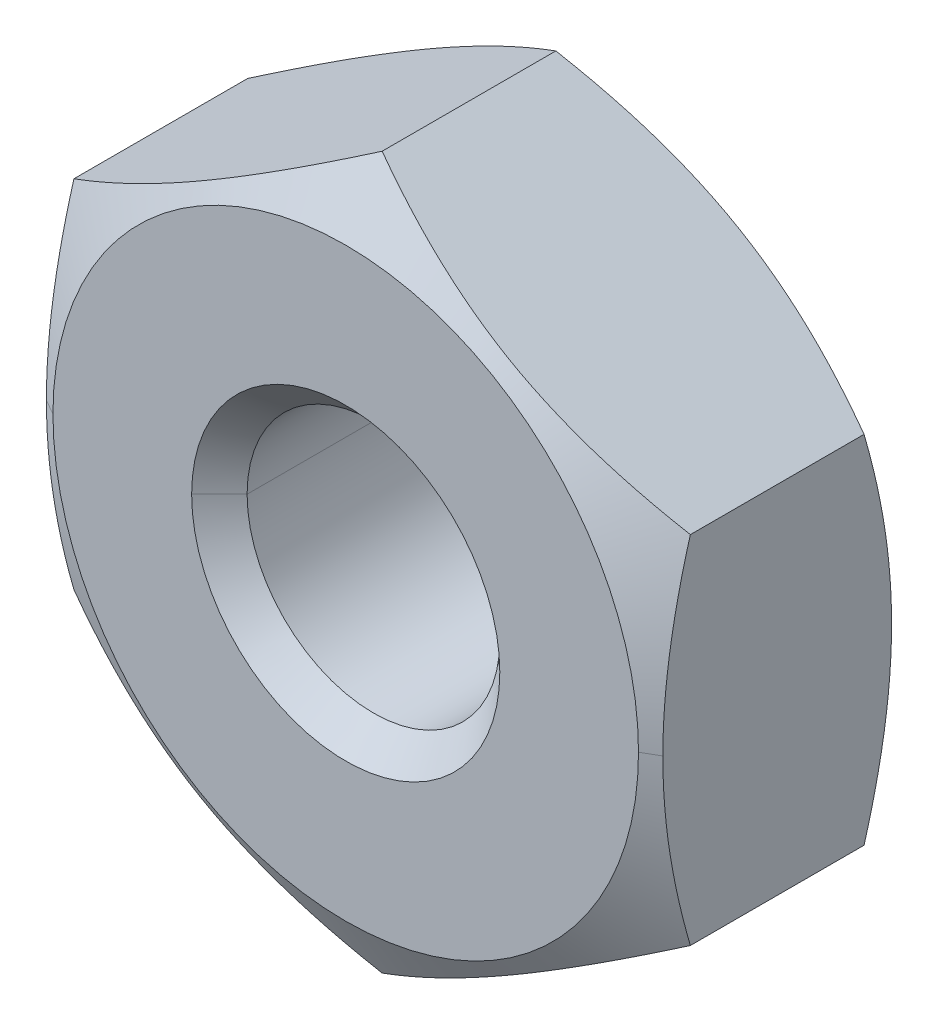
ISO-10303-21;
HEADER;
FILE_DESCRIPTION(('STEP AP214'),'2;1');
FILE_NAME('part.step','',(''),(''),'','','');
FILE_SCHEMA(('AUTOMOTIVE_DESIGN { 1 0 10303 214 1 1 1 1 }'));
ENDSEC;
DATA;
#1=APPLICATION_CONTEXT('core data for automotive mechanical design processes');
#2=APPLICATION_PROTOCOL_DEFINITION('international standard','automotive_design',2000,#1);
#3=PRODUCT_CONTEXT('',#1,'mechanical');
#4=PRODUCT('Part','Part','',(#3));
#5=PRODUCT_RELATED_PRODUCT_CATEGORY('part','',(#4));
#6=PRODUCT_DEFINITION_FORMATION('','',#4);
#7=PRODUCT_DEFINITION_CONTEXT('part definition',#1,'design');
#8=PRODUCT_DEFINITION('design','',#6,#7);
#9=PRODUCT_DEFINITION_SHAPE('','',#8);
#10=(LENGTH_UNIT() NAMED_UNIT(*) SI_UNIT(.MILLI.,.METRE.));
#11=(NAMED_UNIT(*) PLANE_ANGLE_UNIT() SI_UNIT($,.RADIAN.));
#12=(NAMED_UNIT(*) SI_UNIT($,.STERADIAN.) SOLID_ANGLE_UNIT());
#13=UNCERTAINTY_MEASURE_WITH_UNIT(LENGTH_MEASURE(1.E-05),#10,'distance_accuracy_value','');
#14=(GEOMETRIC_REPRESENTATION_CONTEXT(3) GLOBAL_UNCERTAINTY_ASSIGNED_CONTEXT((#13)) GLOBAL_UNIT_ASSIGNED_CONTEXT((#10,
#11,#12)) REPRESENTATION_CONTEXT('',''));
#15=CARTESIAN_POINT('',(0.,0.,0.));
#16=DIRECTION('',(0.,0.,1.));
#17=DIRECTION('',(1.,0.,0.));
#18=AXIS2_PLACEMENT_3D('',#15,#16,#17);
#19=CARTESIAN_POINT('',(0.,0.,2.));
#20=DIRECTION('',(0.,0.,1.));
#21=DIRECTION('',(1.,0.,0.));
#22=AXIS2_PLACEMENT_3D('',#19,#20,#21);
#23=PLANE('',#22);
#24=CARTESIAN_POINT('',(0.,0.,2.00000000000955));
#25=DIRECTION('',(0.,0.,-1.));
#26=DIRECTION('',(1.,0.,0.));
#27=AXIS2_PLACEMENT_3D('',#24,#25,#26);
#28=CIRCLE('',#27,1.24999999997044);
#29=CARTESIAN_POINT('',(1.24999999997044,0.,2.00000000000955));
#30=VERTEX_POINT('',#29);
#31=CARTESIAN_POINT('',(-1.24999999997044,0.,2.00000000000955));
#32=VERTEX_POINT('',#31);
#33=EDGE_CURVE('E407',#30,#32,#28,.T.);
#34=ORIENTED_EDGE('',*,*,#33,.T.);
#35=CARTESIAN_POINT('',(0.,0.,2.00000000000955));
#36=DIRECTION('',(0.,0.,-1.));
#37=DIRECTION('',(1.,0.,0.));
#38=AXIS2_PLACEMENT_3D('',#35,#36,#37);
#39=CIRCLE('',#38,1.24999999997044);
#40=EDGE_CURVE('E29',#32,#30,#39,.T.);
#41=ORIENTED_EDGE('',*,*,#40,.T.);
#42=EDGE_LOOP('',(#34,#41));
#43=FACE_BOUND('',#42,.T.);
#44=CARTESIAN_POINT('',(0.,0.,1.9999999999527));
#45=DIRECTION('',(0.,0.,-1.));
#46=DIRECTION('',(-1.,0.,0.));
#47=AXIS2_PLACEMENT_3D('',#44,#45,#46);
#48=CIRCLE('',#47,2.37500000002721);
#49=CARTESIAN_POINT('',(-2.37500000002721,0.,1.9999999999527));
#50=VERTEX_POINT('',#49);
#51=CARTESIAN_POINT('',(2.37500000002721,0.,1.9999999999527));
#52=VERTEX_POINT('',#51);
#53=EDGE_CURVE('E420',#50,#52,#48,.T.);
#54=ORIENTED_EDGE('',*,*,#53,.F.);
#55=CARTESIAN_POINT('',(0.,0.,1.9999999999527));
#56=DIRECTION('',(0.,0.,-1.));
#57=DIRECTION('',(-1.,0.,0.));
#58=AXIS2_PLACEMENT_3D('',#55,#56,#57);
#59=CIRCLE('',#58,2.37500000002721);
#60=EDGE_CURVE('E11',#52,#50,#59,.T.);
#61=ORIENTED_EDGE('',*,*,#60,.F.);
#62=EDGE_LOOP('',(#54,#61));
#63=FACE_BOUND('',#62,.T.);
#64=ADVANCED_FACE('F16',(#43,#63),#23,.T.);
#65=CARTESIAN_POINT('',(0.,0.,1.70276746405307));
#66=DIRECTION('',(0.,0.,-1.));
#67=DIRECTION('',(-1.,0.,0.));
#68=AXIS2_PLACEMENT_3D('',#65,#66,#67);
#69=CONICAL_SURFACE('',#68,2.88982185386087,1.04719755119066);
#70=DIRECTION('',(0.866025403781469,0.,-0.500000000005144));
#71=VECTOR('',#70,1.);
#72=CARTESIAN_POINT('',(2.88982185386087,0.,1.70276746405307));
#73=LINE('',#72,#71);
#74=CARTESIAN_POINT('',(2.5,0.,1.92783121631873));
#75=VERTEX_POINT('',#74);
#76=EDGE_CURVE('E434',#52,#75,#73,.T.);
#77=ORIENTED_EDGE('',*,*,#76,.F.);
#78=ORIENTED_EDGE('',*,*,#60,.T.);
#79=DIRECTION('',(-0.866025403781469,0.,-0.500000000005144));
#80=VECTOR('',#79,1.);
#81=CARTESIAN_POINT('',(-2.88982185386087,0.,1.70276746405307));
#82=LINE('',#81,#80);
#83=CARTESIAN_POINT('',(-2.5,0.,1.92783121631873));
#84=VERTEX_POINT('',#83);
#85=EDGE_CURVE('E427',#50,#84,#82,.T.);
#86=ORIENTED_EDGE('',*,*,#85,.T.);
#87=CARTESIAN_POINT('',(-2.5,-1.44337567297161,1.70454022262584));
#88=CARTESIAN_POINT('',(-2.5,-0.66987298109294,1.92783121631873));
#89=CARTESIAN_POINT('',(-2.5,0.,1.92783121631873));
#90=B_SPLINE_CURVE_WITH_KNOTS('',2,(#87,#88,#89),.UNSPECIFIED.,.F.,.F.,(3,3),(0.,1.),.UNSPECIFIED.);
#91=CARTESIAN_POINT('',(-2.49999999999585,-1.44337567297161,1.70454022262584));
#92=VERTEX_POINT('',#91);
#93=EDGE_CURVE('E447',#92,#84,#90,.T.);
#94=ORIENTED_EDGE('',*,*,#93,.F.);
#95=CARTESIAN_POINT('',(2.00360561475321E-12,-2.88675134594929,1.70454022262448));
#96=CARTESIAN_POINT('',(-0.668335421610884,-2.50088771037211,1.92731869650076));
#97=CARTESIAN_POINT('',(-1.24761052488357,-2.16644307356276,1.92783033726992));
#98=CARTESIAN_POINT('',(-1.55740370067532,-1.98758390012627,1.92810395997155));
#99=CARTESIAN_POINT('',(-1.88103325566464,-1.80073628943546,1.86777334204022));
#100=CARTESIAN_POINT('',(-2.17432700817317,-1.63140306247302,1.81309788656514));
#101=CARTESIAN_POINT('',(-2.49999999999793,-1.4433756729752,1.70454022262584));
#102=B_SPLINE_CURVE_WITH_KNOTS('',2,(#95,#96,#97,#98,#99,#100,#101),.UNSPECIFIED.,.F.,.F.,(3,2,
2,3),(0.,0.5,0.75,1.),.UNSPECIFIED.);
#103=CARTESIAN_POINT('',(4.08746330383704E-12,-2.88675134594567,1.70454022262448));
#104=VERTEX_POINT('',#103);
#105=EDGE_CURVE('E521',#104,#92,#102,.T.);
#106=ORIENTED_EDGE('',*,*,#105,.F.);
#107=CARTESIAN_POINT('',(2.50000000000203,-1.4433756729727,1.7045402226245));
#108=CARTESIAN_POINT('',(1.83166457839059,-1.82923930854904,1.92731869650039));
#109=CARTESIAN_POINT('',(1.25238947511732,-2.16368394535873,1.92783033726998));
#110=CARTESIAN_POINT('',(0.942596299325253,-2.3425431187954,1.92810395997184));
#111=CARTESIAN_POINT('',(0.618966744336669,-2.52939072948578,1.86777334204052));
#112=CARTESIAN_POINT('',(0.32567299181762,-2.6987239564543,1.81309788656336));
#113=CARTESIAN_POINT('',(4.07347859684806E-12,-2.88675134594565,1.70454022262448));
#114=B_SPLINE_CURVE_WITH_KNOTS('',2,(#107,#108,#109,#110,#111,#112,#113),.UNSPECIFIED.,.F.,.F.,
(3,2,2,3),(0.,0.5,0.75,1.),.UNSPECIFIED.);
#115=CARTESIAN_POINT('',(2.49999999999997,-1.44337567296914,1.7045402226245));
#116=VERTEX_POINT('',#115);
#117=EDGE_CURVE('E498',#116,#104,#114,.T.);
#118=ORIENTED_EDGE('',*,*,#117,.F.);
#119=CARTESIAN_POINT('',(2.5,0.,1.92783121631873));
#120=CARTESIAN_POINT('',(2.5,-0.35727781761372,1.92783121631873));
#121=CARTESIAN_POINT('',(2.5,-0.730007961208925,1.86755448892053));
#122=CARTESIAN_POINT('',(2.5,-1.0680500065789,1.81288740988756));
#123=CARTESIAN_POINT('',(2.5,-1.44337567296914,1.7045402226245));
#124=B_SPLINE_CURVE_WITH_KNOTS('',2,(#119,#120,#121,#122,#123),.UNSPECIFIED.,.F.,.F.,(3,2,3),
(0.,0.5,1.),.UNSPECIFIED.);
#125=EDGE_CURVE('E44',#75,#116,#124,.T.);
#126=ORIENTED_EDGE('',*,*,#125,.F.);
#127=EDGE_LOOP('',(#77,#78,#86,#94,#106,#118,#126));
#128=FACE_BOUND('',#127,.T.);
#129=ADVANCED_FACE('F344',(#128),#69,.T.);
#130=CARTESIAN_POINT('',(0.,0.,2.00000000000955));
#131=DIRECTION('',(0.,0.,1.));
#132=DIRECTION('',(1.,0.,0.));
#133=AXIS2_PLACEMENT_3D('',#130,#131,#132);
#134=CONICAL_SURFACE('',#133,1.24999999997044,0.785398163397448);
#135=DIRECTION('',(-0.707106781186548,0.,0.707106781186548));
#136=VECTOR('',#135,1.);
#137=CARTESIAN_POINT('',(-1.24999999997044,0.,2.00000000000955));
#138=LINE('',#137,#136);
#139=CARTESIAN_POINT('',(-1.025,0.,1.77500000001));
#140=VERTEX_POINT('',#139);
#141=EDGE_CURVE('E406',#140,#32,#138,.T.);
#142=ORIENTED_EDGE('',*,*,#141,.F.);
#143=CARTESIAN_POINT('',(0.,0.,1.77500000001));
#144=DIRECTION('',(0.,0.,-1.));
#145=DIRECTION('',(1.,0.,0.));
#146=AXIS2_PLACEMENT_3D('',#143,#144,#145);
#147=CIRCLE('',#146,1.025);
#148=CARTESIAN_POINT('',(1.025,0.,1.77500000001));
#149=VERTEX_POINT('',#148);
#150=EDGE_CURVE('E428',#140,#149,#147,.T.);
#151=ORIENTED_EDGE('',*,*,#150,.T.);
#152=DIRECTION('',(0.707106781186548,0.,0.707106781186548));
#153=VECTOR('',#152,1.);
#154=CARTESIAN_POINT('',(1.24999999997044,0.,2.00000000000955));
#155=LINE('',#154,#153);
#156=EDGE_CURVE('E411',#149,#30,#155,.T.);
#157=ORIENTED_EDGE('',*,*,#156,.T.);
#158=ORIENTED_EDGE('',*,*,#40,.F.);
#159=EDGE_LOOP('',(#142,#151,#157,#158));
#160=FACE_BOUND('',#159,.T.);
#161=ADVANCED_FACE('F298',(#160),#134,.F.);
#162=CARTESIAN_POINT('',(-2.5,1.443375672974,0.));
#163=DIRECTION('',(-1.,0.,0.));
#164=DIRECTION('',(0.,0.,1.));
#165=AXIS2_PLACEMENT_3D('',#162,#163,#164);
#166=PLANE('',#165);
#167=DIRECTION('',(0.,0.,-1.));
#168=VECTOR('',#167,1.);
#169=CARTESIAN_POINT('',(-2.5,-1.443375672974,0.));
#170=LINE('',#169,#168);
#171=CARTESIAN_POINT('',(-2.50000002884743,-1.44337565631893,0.295459787002283));
#172=VERTEX_POINT('',#171);
#173=EDGE_CURVE('E454',#92,#172,#170,.T.);
#174=ORIENTED_EDGE('',*,*,#173,.F.);
#175=ORIENTED_EDGE('',*,*,#93,.T.);
#176=CARTESIAN_POINT('',(-2.5,0.,1.92783121631873));
#177=CARTESIAN_POINT('',(-2.5,0.35727781761372,1.92783121631873));
#178=CARTESIAN_POINT('',(-2.5,0.730007961208925,1.86755448892053));
#179=CARTESIAN_POINT('',(-2.5,1.0680500065789,1.81288740988756));
#180=CARTESIAN_POINT('',(-2.5,1.44337567296914,1.7045402226245));
#181=B_SPLINE_CURVE_WITH_KNOTS('',2,(#176,#177,#178,#179,#180),.UNSPECIFIED.,.F.,.F.,(3,2,3),
(0.,0.5,1.),.UNSPECIFIED.);
#182=CARTESIAN_POINT('',(-2.49999999999997,1.44337567296914,1.7045402226245));
#183=VERTEX_POINT('',#182);
#184=EDGE_CURVE('E284',#84,#183,#181,.T.);
#185=ORIENTED_EDGE('',*,*,#184,.T.);
#186=DIRECTION('',(0.,0.,1.));
#187=VECTOR('',#186,1.);
#188=CARTESIAN_POINT('',(-2.49999999999994,1.4433756729739,0.));
#189=LINE('',#188,#187);
#190=CARTESIAN_POINT('',(-2.49999999999997,1.44337562325106,0.295459763032684));
#191=VERTEX_POINT('',#190);
#192=EDGE_CURVE('E166',#191,#183,#189,.T.);
#193=ORIENTED_EDGE('',*,*,#192,.F.);
#194=CARTESIAN_POINT('',(-2.5,0.,0.0721687836908265));
#195=CARTESIAN_POINT('',(-2.49998109308463,0.060798261197712,0.0721475555690318));
#196=CARTESIAN_POINT('',(-2.49993000634721,0.121596105599971,0.0734084978787996));
#197=CARTESIAN_POINT('',(-2.49983816726118,0.242824427226123,0.0784527530610178));
#198=CARTESIAN_POINT('',(-2.49979737127157,0.303255357641665,0.082225158604164));
#199=CARTESIAN_POINT('',(-2.4997993705368,0.424358881384574,0.0922880847354647));
#200=CARTESIAN_POINT('',(-2.49984279032347,0.485029924842809,0.098597141656781));
#201=CARTESIAN_POINT('',(-2.49993795340429,0.607200067117762,0.113690004997221));
#202=CARTESIAN_POINT('',(-2.49998983576922,0.668693731609947,0.122517417099114));
#203=CARTESIAN_POINT('',(-2.50000971035315,0.788584140936698,0.141930255858252));
#204=CARTESIAN_POINT('',(-2.49998134518192,0.84699655754729,0.152419577437809));
#205=CARTESIAN_POINT('',(-2.49994589985879,0.964302821423968,0.175458553285553));
#206=CARTESIAN_POINT('',(-2.49993913803297,1.02319116205475,0.188036172893856));
#207=CARTESIAN_POINT('',(-2.49994461896546,1.14178504325956,0.215232710455769));
#208=CARTESIAN_POINT('',(-2.49995726093654,1.2014820200153,0.229888723881456));
#209=CARTESIAN_POINT('',(-2.49998332303391,1.32199317559776,0.26123690017201));
#210=CARTESIAN_POINT('',(-2.49999675483575,1.38279621754652,0.277971985406794));
#211=CARTESIAN_POINT('',(-2.49999999999997,1.44337562325106,0.295459763032683));
#212=B_SPLINE_CURVE_WITH_KNOTS('',3,(#194,#195,#196,#197,#198,#199,#200,#201,#202,#203,#204,
#205,#206,#207,#208,#209,#210,#211),.UNSPECIFIED.,.F.,.F.,(4,2,2,2,2,2,2,2,4),(0.,
0.182380272265665,0.36397358643138,0.546918719995098,0.73324687682234,0.911254661858993,
1.09187358291721,1.27625866757443,1.46542185316941),.UNSPECIFIED.);
#213=CARTESIAN_POINT('',(-2.5,0.,0.0721687836908263));
#214=VERTEX_POINT('',#213);
#215=EDGE_CURVE('E206',#214,#191,#212,.T.);
#216=ORIENTED_EDGE('',*,*,#215,.F.);
#217=CARTESIAN_POINT('',(-2.50000002884743,-1.44337565631893,0.295459787002284));
#218=CARTESIAN_POINT('',(-2.49999645415116,-1.38278166603582,0.277967499298866));
#219=CARTESIAN_POINT('',(-2.49999246007546,-1.32196264991238,0.261233043306671));
#220=CARTESIAN_POINT('',(-2.49999527985821,-1.20137812558611,0.229881923514892));
#221=CARTESIAN_POINT('',(-2.50000183028543,-1.14162350141185,0.215223292330934));
#222=CARTESIAN_POINT('',(-2.50003574995129,-1.0228738636386,0.188017254741656));
#223=CARTESIAN_POINT('',(-2.50006270560887,-0.963887144719858,0.175433880008937));
#224=CARTESIAN_POINT('',(-2.50013219413471,-0.84634458838375,0.15237965918104));
#225=CARTESIAN_POINT('',(-2.50017450741478,-0.787794000826073,0.141882111822548));
#226=CARTESIAN_POINT('',(-2.50016267388675,-0.667756059641647,0.122473784210095));
#227=CARTESIAN_POINT('',(-2.50010415599541,-0.606253847304458,0.113654272550431));
#228=CARTESIAN_POINT('',(-2.49998017096772,-0.484123279641588,0.0985759921229166));
#229=CARTESIAN_POINT('',(-2.49991485749309,-0.423500603421833,0.0922716315696661));
#230=CARTESIAN_POINT('',(-2.49986786717485,-0.302551072855273,0.0822180824336367));
#231=CARTESIAN_POINT('',(-2.49988549772551,-0.242225964701542,0.0784480335237623));
#232=CARTESIAN_POINT('',(-2.49994205800721,-0.121267713041575,0.0734085645694599));
#233=CARTESIAN_POINT('',(-2.4999810593994,-0.0606342169501677,0.0721476243747312));
#234=CARTESIAN_POINT('',(-2.5,0.,0.0721687836908265));
#235=B_SPLINE_CURVE_WITH_KNOTS('',3,(#217,#218,#219,#220,#221,#222,#223,#224,#225,#226,#227,
#228,#229,#230,#231,#232,#233,#234),.UNSPECIFIED.,.F.,.F.,(4,2,2,2,2,2,2,2,4),(0.,
0.189208768976865,0.373763481679598,0.554674513042703,0.733094633669134,0.919445225353956,
1.10224497915985,1.28352102638641,1.46540868537142),.UNSPECIFIED.);
#236=EDGE_CURVE('E158',#172,#214,#235,.T.);
#237=ORIENTED_EDGE('',*,*,#236,.F.);
#238=EDGE_LOOP('',(#174,#175,#185,#193,#216,#237));
#239=FACE_BOUND('',#238,.T.);
#240=ADVANCED_FACE('F289',(#239),#166,.T.);
#241=CARTESIAN_POINT('',(0.,2.886751345948,0.));
#242=DIRECTION('',(-0.500000000000017,0.866025403784429,0.));
#243=DIRECTION('',(0.,0.,1.));
#244=AXIS2_PLACEMENT_3D('',#241,#242,#243);
#245=PLANE('',#244);
#246=ORIENTED_EDGE('',*,*,#192,.T.);
#247=CARTESIAN_POINT('',(-2.50000000000203,1.4433756729727,1.7045402226245));
#248=CARTESIAN_POINT('',(-1.83166457838977,1.82923930854951,1.92731869650066));
#249=CARTESIAN_POINT('',(-1.25238947511732,2.16368394535873,1.92783033726998));
#250=CARTESIAN_POINT('',(-0.942596299324957,2.34254311879557,1.9281039599717));
#251=CARTESIAN_POINT('',(-0.618966744336669,2.52939072948578,1.86777334204052));
#252=CARTESIAN_POINT('',(-0.325672991818174,2.69872395645398,1.81309788656355));
#253=CARTESIAN_POINT('',(-4.07331023354458E-12,2.88675134594565,1.70454022262448));
#254=B_SPLINE_CURVE_WITH_KNOTS('',2,(#247,#248,#249,#250,#251,#252,#253),.UNSPECIFIED.,.F.,.F.,
(3,2,2,3),(0.,0.5,0.75,1.),.UNSPECIFIED.);
#255=CARTESIAN_POINT('',(-4.08741437706399E-12,2.88675134594567,1.70454022262448));
#256=VERTEX_POINT('',#255);
#257=EDGE_CURVE('E182',#183,#256,#254,.T.);
#258=ORIENTED_EDGE('',*,*,#257,.T.);
#259=DIRECTION('',(0.,0.,1.));
#260=VECTOR('',#259,1.);
#261=CARTESIAN_POINT('',(0.,2.88675134594809,0.));
#262=LINE('',#261,#260);
#263=CARTESIAN_POINT('',(-4.30612134731694E-08,2.88675132108663,0.295459763032699));
#264=VERTEX_POINT('',#263);
#265=EDGE_CURVE('E174',#264,#256,#262,.T.);
#266=ORIENTED_EDGE('',*,*,#265,.F.);
#267=CARTESIAN_POINT('',(-2.49999999999997,1.44337562325106,0.295459763032683));
#268=CARTESIAN_POINT('',(-2.44762226937736,1.47361183528355,0.278000804069742));
#269=CARTESIAN_POINT('',(-2.39505020401509,1.50395973626061,0.261296802147691));
#270=CARTESIAN_POINT('',(-2.29082045187129,1.56413994791326,0.22999822187616));
#271=CARTESIAN_POINT('',(-2.23917200848508,1.5939666220239,0.215361920024372));
#272=CARTESIAN_POINT('',(-2.13654154613787,1.65325901439487,0.188192208506404));
#273=CARTESIAN_POINT('',(-2.085566472052,1.68272025068393,0.175623019543618));
#274=CARTESIAN_POINT('',(-1.98399732647153,1.74144063091351,0.152588905596633));
#275=CARTESIAN_POINT('',(-1.93340767979089,1.77069696804713,0.142097378404184));
#276=CARTESIAN_POINT('',(-1.82964821465857,1.8305889449133,0.122693726346506));
#277=CARTESIAN_POINT('',(-1.77646343446077,1.86122823538282,0.113872235222177));
#278=CARTESIAN_POINT('',(-1.67084254771448,1.92206867746418,0.0987804108311791));
#279=CARTESIAN_POINT('',(-1.61841139217352,1.95226710656987,0.0924648317818535));
#280=CARTESIAN_POINT('',(-1.51384183407749,2.01258385821511,0.082371989258566));
#281=CARTESIAN_POINT('',(-1.46170462300898,2.04270075845054,0.0785740534959627));
#282=CARTESIAN_POINT('',(-1.35718494857626,2.10312297926297,0.0734892560851121));
#283=CARTESIAN_POINT('',(-1.30480224712339,2.13342859326143,0.0722108097727806));
#284=CARTESIAN_POINT('',(-1.19963448104258,2.19413684565265,0.0721282470367467));
#285=CARTESIAN_POINT('',(-1.14684902306628,2.22453882489204,0.0733403463694213));
#286=CARTESIAN_POINT('',(-1.04161144802195,2.28518040093727,0.0783160573353616));
#287=CARTESIAN_POINT('',(-0.989158881015093,2.3154201278034,0.0820685213919435));
#288=CARTESIAN_POINT('',(-0.884083184063616,2.37609138449002,0.092097654481706));
#289=CARTESIAN_POINT('',(-0.831461699353421,2.40652266287961,0.0983929394637272));
#290=CARTESIAN_POINT('',(-0.725501001061631,2.46781016556249,0.113469962915259));
#291=CARTESIAN_POINT('',(-0.67216659615028,2.49866379236549,0.122295686881778));
#292=CARTESIAN_POINT('',(-0.568147638835134,2.55874260562301,0.141713208235058));
#293=CARTESIAN_POINT('',(-0.517451307470826,2.58797888035576,0.152208304033416));
#294=CARTESIAN_POINT('',(-0.415652164866734,2.64671117137563,0.175267239476208));
#295=CARTESIAN_POINT('',(-0.364554301060327,2.67620470605892,0.187859169266693));
#296=CARTESIAN_POINT('',(-0.261658110625061,2.7356183142649,0.215092375708838));
#297=CARTESIAN_POINT('',(-0.2098674403792,2.76553443286029,0.229770957944074));
#298=CARTESIAN_POINT('',(-0.10531495856753,2.82592825602234,0.261172302721103));
#299=CARTESIAN_POINT('',(-0.0525628546971453,2.85640036919485,0.277938251662623));
#300=CARTESIAN_POINT('',(-4.30612176134626E-08,2.88675132108663,0.295459763032698));
#301=B_SPLINE_CURVE_WITH_KNOTS('',3,(#267,#268,#269,#270,#271,#272,#273,#274,#275,#276,#277,
#278,#279,#280,#281,#282,#283,#284,#285,#286,#287,#288,#289,#290,#291,#292,#293,#294,#295,#296,
#297,#298,#299,#300),.UNSPECIFIED.,.F.,.F.,(4,2,2,2,2,2,2,2,2,2,2,2,2,2,2,2,4),(0.,
0.188848260031547,0.373059607191242,0.553638064568608,0.731728952680531,0.917714710817092,
1.10017023570626,1.28110842928788,1.46264995631458,1.64537723141293,1.82730781976195,
2.01059518355017,2.19728480665109,2.37562038034568,2.55657216849064,2.74130282149598,
2.93083076719199),.UNSPECIFIED.);
#302=EDGE_CURVE('E178',#191,#264,#301,.T.);
#303=ORIENTED_EDGE('',*,*,#302,.F.);
#304=EDGE_LOOP('',(#246,#258,#266,#303));
#305=FACE_BOUND('',#304,.T.);
#306=ADVANCED_FACE('F176',(#305),#245,.T.);
#307=CARTESIAN_POINT('',(2.5,1.443375672974,0.));
#308=DIRECTION('',(0.500000000000017,0.866025403784429,0.));
#309=DIRECTION('',(0.,0.,-1.));
#310=AXIS2_PLACEMENT_3D('',#307,#308,#309);
#311=PLANE('',#310);
#312=ORIENTED_EDGE('',*,*,#265,.T.);
#313=CARTESIAN_POINT('',(-2.00360561475321E-12,2.88675134594929,1.70454022262448));
#314=CARTESIAN_POINT('',(0.668335421610876,2.50088771037211,1.92731869650075));
#315=CARTESIAN_POINT('',(1.24761052488264,2.1664430735633,1.92783033726991));
#316=CARTESIAN_POINT('',(1.557403700675,1.98758390012646,1.92810395997155));
#317=CARTESIAN_POINT('',(1.88103325566327,1.80073628943625,1.86777334204047));
#318=CARTESIAN_POINT('',(2.17432700818117,1.6314030624684,1.81309788656369));
#319=CARTESIAN_POINT('',(2.49999999999586,1.44337567297639,1.70454022262446));
#320=B_SPLINE_CURVE_WITH_KNOTS('',2,(#313,#314,#315,#316,#317,#318,#319),.UNSPECIFIED.,.F.,.F.,
(3,2,2,3),(0.,0.5,0.75,1.),.UNSPECIFIED.);
#321=CARTESIAN_POINT('',(2.49999999999585,1.44337567297639,1.70454022262446));
#322=VERTEX_POINT('',#321);
#323=EDGE_CURVE('E470',#256,#322,#320,.T.);
#324=ORIENTED_EDGE('',*,*,#323,.T.);
#325=DIRECTION('',(0.,0.,1.));
#326=VECTOR('',#325,1.);
#327=CARTESIAN_POINT('',(2.5,1.443375672974,0.));
#328=LINE('',#327,#326);
#329=CARTESIAN_POINT('',(2.4999999569619,1.44337569782206,0.295459763040441));
#330=VERTEX_POINT('',#329);
#331=EDGE_CURVE('E193',#330,#322,#328,.T.);
#332=ORIENTED_EDGE('',*,*,#331,.F.);
#333=CARTESIAN_POINT('',(-4.30612176134626E-08,2.88675132108663,0.295459763032698));
#334=CARTESIAN_POINT('',(0.0523741499853835,2.85650898179058,0.278000804069447));
#335=CARTESIAN_POINT('',(0.104942235865143,2.82615418814543,0.261296802147116));
#336=CARTESIAN_POINT('',(0.209174704035301,2.76597868078398,0.22999822187509));
#337=CARTESIAN_POINT('',(0.260829583219599,2.73616315380037,0.215361920023086));
#338=CARTESIAN_POINT('',(0.363493532439614,2.67692876238991,0.188192208504754));
#339=CARTESIAN_POINT('',(0.414495248536787,2.64751367141571,0.175623019541819));
#340=CARTESIAN_POINT('',(0.516133162327768,2.58891240121593,0.152588905594592));
#341=CARTESIAN_POINT('',(0.566764716848524,2.5597286505882,0.14209737840205));
#342=CARTESIAN_POINT('',(0.670512422865365,2.49981630633259,0.122693726344375));
#343=CARTESIAN_POINT('',(0.723639216865462,2.46907658082097,0.113872235220131));
#344=CARTESIAN_POINT('',(0.829139028660136,2.40802643076827,0.0987804108293655));
#345=CARTESIAN_POINT('',(0.881507213191455,2.3777189326724,0.0924648317801977));
#346=CARTESIAN_POINT('',(0.986027831440108,2.31731741472023,0.0823719892572867));
#347=CARTESIAN_POINT('',(1.03817843766267,2.2872237155695,0.0785740534949141));
#348=CARTESIAN_POINT('',(1.14276545305825,2.22691813272014,0.0734892560845453));
#349=CARTESIAN_POINT('',(1.19520223538602,2.19670618954141,0.072210809772479));
#350=CARTESIAN_POINT('',(1.30036100721797,2.13598235865078,0.0721282470371446));
#351=CARTESIAN_POINT('',(1.35308262255277,2.10546980071254,0.0733403463701875));
#352=CARTESIAN_POINT('',(1.45821855545632,2.04465217531377,0.0783160573369869));
#353=CARTESIAN_POINT('',(1.51063321062999,2.01434678322493,0.0820685213940886));
#354=CARTESIAN_POINT('',(1.61571390867783,1.95368418868702,0.0920976544849814));
#355=CARTESIAN_POINT('',(1.66837891118924,1.9233282853373,0.0983929394676438));
#356=CARTESIAN_POINT('',(1.77443579459614,1.86220738015346,0.113469962920512));
#357=CARTESIAN_POINT('',(1.82782302166392,1.83144524400478,0.122295686887754));
#358=CARTESIAN_POINT('',(1.93186227883201,1.77140159112288,0.14171320824194));
#359=CARTESIAN_POINT('',(1.98252980114322,1.74211541764974,0.152208304040349));
#360=CARTESIAN_POINT('',(2.08429302848824,1.68332091958239,0.175267239483274));
#361=CARTESIAN_POINT('',(2.13538411067338,1.65381563878926,0.18785916927385));
#362=CARTESIAN_POINT('',(2.23828589992581,1.59441172802396,0.215092375716168));
#363=CARTESIAN_POINT('',(2.29008935373407,1.56451775121032,0.229770957951492));
#364=CARTESIAN_POINT('',(2.39466817972835,1.50416955751483,0.261172302728697));
#365=CARTESIAN_POINT('',(2.44743385577727,1.47372095204674,0.277938251670311));
#366=CARTESIAN_POINT('',(2.4999999569619,1.44337569782206,0.295459763040441));
#367=B_SPLINE_CURVE_WITH_KNOTS('',3,(#333,#334,#335,#336,#337,#338,#339,#340,#341,#342,#343,
#344,#345,#346,#347,#348,#349,#350,#351,#352,#353,#354,#355,#356,#357,#358,#359,#360,#361,#362,
#363,#364,#365,#366),.UNSPECIFIED.,.F.,.F.,(4,2,2,2,2,2,2,2,2,2,2,2,2,2,2,2,4),(0.,
0.188848260034945,0.373059607198067,0.553638064578936,0.731728952694498,0.917714710833295,
1.10017023572552,1.28110842931112,1.4626499563428,1.64537723144128,1.82730781979253,
2.01059518358522,2.19728480669295,2.37562038038274,2.55657216852374,2.74130282152598,
2.93083076721972),.UNSPECIFIED.);
#368=EDGE_CURVE('E190',#264,#330,#367,.T.);
#369=ORIENTED_EDGE('',*,*,#368,.F.);
#370=EDGE_LOOP('',(#312,#324,#332,#369));
#371=FACE_BOUND('',#370,.T.);
#372=ADVANCED_FACE('F192',(#371),#311,.T.);
#373=CARTESIAN_POINT('',(2.5,-1.443375672974,0.));
#374=DIRECTION('',(1.,0.,0.));
#375=DIRECTION('',(0.,1.,0.));
#376=AXIS2_PLACEMENT_3D('',#373,#374,#375);
#377=PLANE('',#376);
#378=ORIENTED_EDGE('',*,*,#331,.T.);
#379=CARTESIAN_POINT('',(2.5,1.4433756729764,1.70454022262446));
#380=CARTESIAN_POINT('',(2.5,0.66987298109294,1.92783121631873));
#381=CARTESIAN_POINT('',(2.5,0.,1.92783121631873));
#382=B_SPLINE_CURVE_WITH_KNOTS('',2,(#379,#380,#381),.UNSPECIFIED.,.F.,.F.,(3,3),(0.,1.),.UNSPECIFIED.);
#383=EDGE_CURVE('E475',#322,#75,#382,.T.);
#384=ORIENTED_EDGE('',*,*,#383,.T.);
#385=ORIENTED_EDGE('',*,*,#125,.T.);
#386=DIRECTION('',(0.,0.,1.));
#387=VECTOR('',#386,1.);
#388=CARTESIAN_POINT('',(2.49999999999994,-1.4433756729739,0.));
#389=LINE('',#388,#387);
#390=CARTESIAN_POINT('',(2.49999999999997,-1.44337562327512,0.29545976303963));
#391=VERTEX_POINT('',#390);
#392=EDGE_CURVE('E496',#391,#116,#389,.T.);
#393=ORIENTED_EDGE('',*,*,#392,.F.);
#394=CARTESIAN_POINT('',(2.5,0.,0.0721687836908265));
#395=CARTESIAN_POINT('',(2.49998109308466,-0.060798261181605,0.0721475555690574));
#396=CARTESIAN_POINT('',(2.49993000634742,-0.12159610556776,0.0734084978782393));
#397=CARTESIAN_POINT('',(2.4998381672618,-0.242824427162873,0.0784527530580436));
#398=CARTESIAN_POINT('',(2.49979737127242,-0.303255357563478,0.08222515859941));
#399=CARTESIAN_POINT('',(2.49979937053794,-0.424358881277258,0.0922880847259298));
#400=CARTESIAN_POINT('',(2.49984279032466,-0.485029924721299,0.0985971416442648));
#401=CARTESIAN_POINT('',(2.49993795340512,-0.607200066968222,0.113690004977478));
#402=CARTESIAN_POINT('',(2.49998983576963,-0.668693731446573,0.122517417075118));
#403=CARTESIAN_POINT('',(2.50000971035277,-0.788584140774886,0.141930255829736));
#404=CARTESIAN_POINT('',(2.49998134518114,-0.846996557400704,0.152419577410036));
#405=CARTESIAN_POINT('',(2.49994589985764,-0.964302821308609,0.175458553260767));
#406=CARTESIAN_POINT('',(2.49993913803186,-1.02319116195538,0.188036172871356));
#407=CARTESIAN_POINT('',(2.49994461896459,-1.14178504319336,0.215232710439243));
#408=CARTESIAN_POINT('',(2.49995726093587,-1.20148201996626,0.229888723868672));
#409=CARTESIAN_POINT('',(2.49998332303363,-1.32199317558459,0.261236900168123));
#410=CARTESIAN_POINT('',(2.49999675483566,-1.38279621755202,0.277971985408123));
#411=CARTESIAN_POINT('',(2.49999999999998,-1.44337562327511,0.29545976303963));
#412=B_SPLINE_CURVE_WITH_KNOTS('',3,(#394,#395,#396,#397,#398,#399,#400,#401,#402,#403,#404,
#405,#406,#407,#408,#409,#410,#411),.UNSPECIFIED.,.F.,.F.,(4,2,2,2,2,2,2,2,4),(0.,
0.182380272217365,0.363973586338064,0.546918719858543,0.733246876642925,0.911254661724894,
1.09187358283143,1.27625866754131,1.46542185319444),.UNSPECIFIED.);
#413=CARTESIAN_POINT('',(2.5,0.,0.0721687836908263));
#414=VERTEX_POINT('',#413);
#415=EDGE_CURVE('E257',#414,#391,#412,.T.);
#416=ORIENTED_EDGE('',*,*,#415,.F.);
#417=CARTESIAN_POINT('',(2.4999999569619,1.44337569782206,0.295459763040441));
#418=CARTESIAN_POINT('',(2.49999638842831,1.38278171092932,0.2779674786394));
#419=CARTESIAN_POINT('',(2.49999240025555,1.32196269826402,0.261233025835679));
#420=CARTESIAN_POINT('',(2.49999523104095,1.20137818007071,0.229881911740969));
#421=CARTESIAN_POINT('',(2.50000178658422,1.14162355856131,0.215223283098531));
#422=CARTESIAN_POINT('',(2.50003571561967,1.02287392546682,0.188017249918754));
#423=CARTESIAN_POINT('',(2.50006267554609,0.963887208553625,0.175433877085661));
#424=CARTESIAN_POINT('',(2.5001321716786,0.846344655732349,0.152379659375558));
#425=CARTESIAN_POINT('',(2.50017448830867,0.787794069677998,0.141882113262624));
#426=CARTESIAN_POINT('',(2.50016266072173,0.667756123283402,0.122473786258212));
#427=CARTESIAN_POINT('',(2.5001041453668,0.606253904188895,0.113654274235246));
#428=CARTESIAN_POINT('',(2.49998016450402,0.484123323626336,0.0985759932045731));
#429=CARTESIAN_POINT('',(2.49991485267435,0.42350064126622,0.0922716323921835));
#430=CARTESIAN_POINT('',(2.49986786488237,0.302551099000783,0.0822180828573072));
#431=CARTESIAN_POINT('',(2.49988549631986,0.242225985290282,0.0784480337856005));
#432=CARTESIAN_POINT('',(2.49994205774883,0.12126772306361,0.0734085646309426));
#433=CARTESIAN_POINT('',(2.49998105939914,0.0606342219632505,0.0721476243745038));
#434=CARTESIAN_POINT('',(2.5,0.,0.0721687836908265));
#435=B_SPLINE_CURVE_WITH_KNOTS('',3,(#417,#418,#419,#420,#421,#422,#423,#424,#425,#426,#427,
#428,#429,#430,#431,#432,#433,#434),.UNSPECIFIED.,.F.,.F.,(4,2,2,2,2,2,2,2,4),(0.,
0.189208756449059,0.373763459581675,0.554674483892213,0.733094599444776,0.919445211345915,
1.10224498355362,1.28352104745081,1.46540872146877),.UNSPECIFIED.);
#436=EDGE_CURVE('E199',#330,#414,#435,.T.);
#437=ORIENTED_EDGE('',*,*,#436,.F.);
#438=EDGE_LOOP('',(#378,#384,#385,#393,#416,#437));
#439=FACE_BOUND('',#438,.T.);
#440=ADVANCED_FACE('F229',(#439),#377,.T.);
#441=CARTESIAN_POINT('',(0.,-2.886751345948,0.));
#442=DIRECTION('',(0.500000000000017,-0.866025403784429,0.));
#443=DIRECTION('',(0.,0.,-1.));
#444=AXIS2_PLACEMENT_3D('',#441,#442,#443);
#445=PLANE('',#444);
#446=ORIENTED_EDGE('',*,*,#392,.T.);
#447=ORIENTED_EDGE('',*,*,#117,.T.);
#448=DIRECTION('',(0.,0.,1.));
#449=VECTOR('',#448,1.);
#450=CARTESIAN_POINT('',(0.,-2.88675134594809,0.));
#451=LINE('',#450,#449);
#452=CARTESIAN_POINT('',(4.30437831117825E-08,-2.88675132109669,0.295459763038509));
#453=VERTEX_POINT('',#452);
#454=EDGE_CURVE('E431',#453,#104,#451,.T.);
#455=ORIENTED_EDGE('',*,*,#454,.F.);
#456=CARTESIAN_POINT('',(2.49999999999998,-1.44337562327511,0.29545976303963));
#457=CARTESIAN_POINT('',(2.4476222693765,-1.47361183530705,0.278000804076314));
#458=CARTESIAN_POINT('',(2.39505020401333,-1.50395973628348,0.261296802153851));
#459=CARTESIAN_POINT('',(2.2908204518678,-1.56413994793472,0.229998221881482));
#460=CARTESIAN_POINT('',(2.23917200848076,-1.59396662204458,0.215361920029266));
#461=CARTESIAN_POINT('',(2.136541546132,-1.65325901441386,0.188192208510435));
#462=CARTESIAN_POINT('',(2.08556647204541,-1.68272025070201,0.175623019547212));
#463=CARTESIAN_POINT('',(1.98399732646358,-1.74144063092957,0.152588905599305));
#464=CARTESIAN_POINT('',(1.93340767978231,-1.77069696806209,0.142097378406367));
#465=CARTESIAN_POINT('',(1.82964821464844,-1.83058894492638,0.122693726347711));
#466=CARTESIAN_POINT('',(1.77646343444972,-1.86122823539513,0.113872235222911));
#467=CARTESIAN_POINT('',(1.67084254770145,-1.92206867747556,0.0987804108311954));
#468=CARTESIAN_POINT('',(1.61841139215942,-1.95226710658109,0.0924648317816335));
#469=CARTESIAN_POINT('',(1.51384183406096,-2.01258385822649,0.0823719892580643));
#470=CARTESIAN_POINT('',(1.46170462299108,-2.04270075846225,0.0785740534954335));
#471=CARTESIAN_POINT('',(1.35718494855517,-2.10312297927569,0.0734892560846585));
#472=CARTESIAN_POINT('',(1.30480224710047,-2.13342859327483,0.0722108097724545));
#473=CARTESIAN_POINT('',(1.19963448101998,-2.19413684566552,0.0721282470370407));
#474=CARTESIAN_POINT('',(1.14684902304582,-2.22453882490371,0.0733403463700297));
#475=CARTESIAN_POINT('',(1.04161144800425,-2.2851804009478,0.0783160573366644));
#476=CARTESIAN_POINT('',(0.989158880998016,-2.315420127814,0.082068521393709));
#477=CARTESIAN_POINT('',(0.884083184045989,-2.37609138450166,0.0920976544844378));
#478=CARTESIAN_POINT('',(0.831461699334632,-2.40652266289221,0.098392939467045));
#479=CARTESIAN_POINT('',(0.725501001038323,-2.46781016557734,0.113469962919646));
#480=CARTESIAN_POINT('',(0.672166596123616,-2.49866379238161,0.122295686886721));
#481=CARTESIAN_POINT('',(0.568147638807638,-2.5587426056382,0.141713208240215));
#482=CARTESIAN_POINT('',(0.517451307445828,-2.58797888036878,0.152208304037996));
#483=CARTESIAN_POINT('',(0.415652164845991,-2.6467111713856,0.175267239480059));
#484=CARTESIAN_POINT('',(0.364554301041356,-2.67620470606801,0.18785916927044));
#485=CARTESIAN_POINT('',(0.261658110608489,-2.7356183142731,0.215092375712648));
#486=CARTESIAN_POINT('',(0.209867440363269,-2.76553443286847,0.229770957948095));
#487=CARTESIAN_POINT('',(0.105314958551547,-2.82592825603119,0.261172302725856));
#488=CARTESIAN_POINT('',(0.0525628546804784,-2.85640036920437,0.277938251667939));
#489=CARTESIAN_POINT('',(4.30437727837345E-08,-2.88675132109669,0.295459763038509));
#490=B_SPLINE_CURVE_WITH_KNOTS('',3,(#456,#457,#458,#459,#460,#461,#462,#463,#464,#465,#466,
#467,#468,#469,#470,#471,#472,#473,#474,#475,#476,#477,#478,#479,#480,#481,#482,#483,#484,#485,
#486,#487,#488,#489),.UNSPECIFIED.,.F.,.F.,(4,2,2,2,2,2,2,2,2,2,2,2,2,2,2,2,4),(0.,
0.188848260033231,0.373059607194181,0.553638064572323,0.731728952684497,0.91771471082246,
1.10017023571421,1.28110842929987,1.46264995633232,1.6453772314233,1.8273078197709,
2.01059518356376,2.19728480667543,2.37562038036013,2.55657216849923,2.74130282150308,
2.93083076720223),.UNSPECIFIED.);
#491=EDGE_CURVE('E367',#391,#453,#490,.T.);
#492=ORIENTED_EDGE('',*,*,#491,.F.);
#493=EDGE_LOOP('',(#446,#447,#455,#492));
#494=FACE_BOUND('',#493,.T.);
#495=ADVANCED_FACE('F227',(#494),#445,.T.);
#496=CARTESIAN_POINT('',(-2.5,-1.443375672974,0.));
#497=DIRECTION('',(-0.500000000000017,-0.866025403784429,0.));
#498=DIRECTION('',(-0.866025403784429,0.500000000000017,0.));
#499=AXIS2_PLACEMENT_3D('',#496,#497,#498);
#500=PLANE('',#499);
#501=ORIENTED_EDGE('',*,*,#454,.T.);
#502=ORIENTED_EDGE('',*,*,#105,.T.);
#503=ORIENTED_EDGE('',*,*,#173,.T.);
#504=CARTESIAN_POINT('',(4.30437727837345E-08,-2.88675132109669,0.295459763038509));
#505=CARTESIAN_POINT('',(-0.0523741525526256,-2.85650898032676,0.278000803224724));
#506=CARTESIAN_POINT('',(-0.104942241001876,-2.82615418519694,0.261296800525271));
#507=CARTESIAN_POINT('',(-0.209174714227433,-2.76597867491811,0.229998218912301));
#508=CARTESIAN_POINT('',(-0.260829595896255,-2.73616314650249,0.215361916490255));
#509=CARTESIAN_POINT('',(-0.363493550043337,-2.676928752258,0.188192204043818));
#510=CARTESIAN_POINT('',(-0.41449526858213,-2.64751365988218,0.175623014718));
#511=CARTESIAN_POINT('',(-0.516133187259822,-2.58891238688058,0.152588900257263));
#512=CARTESIAN_POINT('',(-0.566764744225329,-2.55972863485278,0.142097372911527));
#513=CARTESIAN_POINT('',(-0.670512455325165,-2.49981628765725,0.122693720742775));
#514=CARTESIAN_POINT('',(-0.723639251964154,-2.46907656060395,0.113872229673517));
#515=CARTESIAN_POINT('',(-0.829139068946849,-2.40802640751774,0.0987804056667991));
#516=CARTESIAN_POINT('',(-0.881507256026894,-2.37771890793033,0.0924648269394406));
#517=CARTESIAN_POINT('',(-0.986027879379903,-2.31731738701307,0.0823719853312185));
#518=CARTESIAN_POINT('',(-1.03817848815816,-2.28722368638863,0.0785740501605426));
#519=CARTESIAN_POINT('',(-1.14276550875527,-2.22691810055024,0.0734892541967653));
#520=CARTESIAN_POINT('',(-1.19520229372905,-2.19670615585623,0.0722108087452505));
#521=CARTESIAN_POINT('',(-1.30036107047377,-2.13598232213088,0.0721282479813504));
#522=CARTESIAN_POINT('',(-1.35308268807543,-2.10546976287389,0.0733403484101768));
#523=CARTESIAN_POINT('',(-1.45821862553506,-2.04465213483183,0.0783160617672869));
#524=CARTESIAN_POINT('',(-1.51063328299803,-2.01434674141841,0.0820685271217293));
#525=CARTESIAN_POINT('',(-1.61571398570063,-1.95368414419197,0.0920976629977934));
#526=CARTESIAN_POINT('',(-1.66837899057678,-1.92332823947894,0.0983929494748857));
#527=CARTESIAN_POINT('',(-1.77443587884053,-1.86220733151393,0.113469976114559));
#528=CARTESIAN_POINT('',(-1.82782310839882,-1.83144519394868,0.122295701783075));
#529=CARTESIAN_POINT('',(-1.93186236710125,-1.77140154014046,0.141713225935122));
#530=CARTESIAN_POINT('',(-1.98252988848082,-1.74211536715276,0.152208322697717));
#531=CARTESIAN_POINT('',(-2.08429311362776,-1.68332087018979,0.175267259835872));
#532=CARTESIAN_POINT('',(-2.13538419454796,-1.65381559001372,0.187859190343544));
#533=CARTESIAN_POINT('',(-2.238285980917,-1.59441168075595,0.215092398001022));
#534=CARTESIAN_POINT('',(-2.29008943311002,-1.56451770483227,0.229770980718726));
#535=CARTESIAN_POINT('',(-2.39466825550413,-1.50416951331502,0.26117232623883));
#536=CARTESIAN_POINT('',(-2.44743392957329,-1.47372090913706,0.277938275424671));
#537=CARTESIAN_POINT('',(-2.50000002884743,-1.44337565631893,0.295459787002284));
#538=B_SPLINE_CURVE_WITH_KNOTS('',3,(#504,#505,#506,#507,#508,#509,#510,#511,#512,#513,#514,
#515,#516,#517,#518,#519,#520,#521,#522,#523,#524,#525,#526,#527,#528,#529,#530,#531,#532,#533,
#534,#535,#536,#537),.UNSPECIFIED.,.F.,.F.,(4,2,2,2,2,2,2,2,2,2,2,2,2,2,2,2,4),(0.,
0.188848269232439,0.373059625154459,0.5536380910173,0.731728987527518,0.917714754710809,
1.10017028830565,1.2811084906035,1.46265002671789,1.64537730974151,1.82730790624728,
2.01059527864234,2.19728491097906,2.37562048208663,2.55657226656233,2.74130291454001,
2.93083085360766),.UNSPECIFIED.);
#539=EDGE_CURVE('E327',#453,#172,#538,.T.);
#540=ORIENTED_EDGE('',*,*,#539,.F.);
#541=EDGE_LOOP('',(#501,#502,#503,#540));
#542=FACE_BOUND('',#541,.T.);
#543=ADVANCED_FACE('F531',(#542),#500,.T.);
#544=CARTESIAN_POINT('',(0.,0.,2.));
#545=DIRECTION('',(0.,0.,1.));
#546=DIRECTION('',(1.,0.,0.));
#547=AXIS2_PLACEMENT_3D('',#544,#545,#546);
#548=CYLINDRICAL_SURFACE('',#547,1.025);
#549=DIRECTION('',(0.,0.,1.));
#550=VECTOR('',#549,1.);
#551=CARTESIAN_POINT('',(-1.025,0.,2.));
#552=LINE('',#551,#550);
#553=CARTESIAN_POINT('',(-1.02500000002692,0.,0.225000000000364));
#554=VERTEX_POINT('',#553);
#555=EDGE_CURVE('E266',#554,#140,#552,.T.);
#556=ORIENTED_EDGE('',*,*,#555,.F.);
#557=CARTESIAN_POINT('',(0.,0.,0.225000000000364));
#558=DIRECTION('',(0.,0.,-1.));
#559=DIRECTION('',(-1.,0.,0.));
#560=AXIS2_PLACEMENT_3D('',#557,#558,#559);
#561=CIRCLE('',#560,1.02500000002692);
#562=CARTESIAN_POINT('',(1.02500000002692,0.,0.225000000000364));
#563=VERTEX_POINT('',#562);
#564=EDGE_CURVE('E384',#554,#563,#561,.T.);
#565=ORIENTED_EDGE('',*,*,#564,.T.);
#566=DIRECTION('',(0.,0.,1.));
#567=VECTOR('',#566,1.);
#568=CARTESIAN_POINT('',(1.025,0.,2.));
#569=LINE('',#568,#567);
#570=EDGE_CURVE('E403',#563,#149,#569,.T.);
#571=ORIENTED_EDGE('',*,*,#570,.T.);
#572=ORIENTED_EDGE('',*,*,#150,.F.);
#573=EDGE_LOOP('',(#556,#565,#571,#572));
#574=FACE_BOUND('',#573,.T.);
#575=ADVANCED_FACE('F343',(#574),#548,.F.);
#576=CARTESIAN_POINT('',(0.,0.,0.297232535956482));
#577=DIRECTION('',(0.,0.,1.));
#578=DIRECTION('',(1.,0.,0.));
#579=AXIS2_PLACEMENT_3D('',#576,#577,#578);
#580=CONICAL_SURFACE('',#579,2.88982185386087,1.04719755119066);
#581=DIRECTION('',(-0.866025403781469,0.,0.500000000005144));
#582=VECTOR('',#581,1.);
#583=CARTESIAN_POINT('',(-2.88982185386087,0.,0.297232535956482));
#584=LINE('',#583,#582);
#585=CARTESIAN_POINT('',(-2.37500000002721,0.,5.68436899113511E-11));
#586=VERTEX_POINT('',#585);
#587=EDGE_CURVE('E314',#586,#214,#584,.T.);
#588=ORIENTED_EDGE('',*,*,#587,.F.);
#589=CARTESIAN_POINT('',(0.,0.,5.68436899113511E-11));
#590=DIRECTION('',(0.,0.,1.));
#591=DIRECTION('',(1.,0.,0.));
#592=AXIS2_PLACEMENT_3D('',#589,#590,#591);
#593=CIRCLE('',#592,2.37500000002721);
#594=CARTESIAN_POINT('',(2.37500000002721,0.,5.68436899113511E-11));
#595=VERTEX_POINT('',#594);
#596=EDGE_CURVE('E65',#586,#595,#593,.T.);
#597=ORIENTED_EDGE('',*,*,#596,.T.);
#598=DIRECTION('',(0.866025403781469,0.,0.500000000005144));
#599=VECTOR('',#598,1.);
#600=CARTESIAN_POINT('',(2.88982185386087,0.,0.297232535956482));
#601=LINE('',#600,#599);
#602=EDGE_CURVE('E260',#595,#414,#601,.T.);
#603=ORIENTED_EDGE('',*,*,#602,.T.);
#604=ORIENTED_EDGE('',*,*,#415,.T.);
#605=ORIENTED_EDGE('',*,*,#491,.T.);
#606=ORIENTED_EDGE('',*,*,#539,.T.);
#607=ORIENTED_EDGE('',*,*,#236,.T.);
#608=EDGE_LOOP('',(#588,#597,#603,#604,#605,#606,#607));
#609=FACE_BOUND('',#608,.T.);
#610=ADVANCED_FACE('F333',(#609),#580,.T.);
#611=CARTESIAN_POINT('',(0.,0.,0.));
#612=DIRECTION('',(0.,0.,-1.));
#613=DIRECTION('',(-1.,0.,0.));
#614=AXIS2_PLACEMENT_3D('',#611,#612,#613);
#615=CONICAL_SURFACE('',#614,1.25000000002728,0.785398163397448);
#616=DIRECTION('',(0.707106781186548,0.,-0.707106781186548));
#617=VECTOR('',#616,1.);
#618=CARTESIAN_POINT('',(1.25000000002728,0.,0.));
#619=LINE('',#618,#617);
#620=CARTESIAN_POINT('',(1.25000000002728,0.,0.));
#621=VERTEX_POINT('',#620);
#622=EDGE_CURVE('E416',#563,#621,#619,.T.);
#623=ORIENTED_EDGE('',*,*,#622,.F.);
#624=ORIENTED_EDGE('',*,*,#564,.F.);
#625=DIRECTION('',(-0.707106781186548,0.,-0.707106781186548));
#626=VECTOR('',#625,1.);
#627=CARTESIAN_POINT('',(-1.25000000002728,0.,0.));
#628=LINE('',#627,#626);
#629=CARTESIAN_POINT('',(-1.25000000002728,0.,0.));
#630=VERTEX_POINT('',#629);
#631=EDGE_CURVE('E421',#554,#630,#628,.T.);
#632=ORIENTED_EDGE('',*,*,#631,.T.);
#633=CARTESIAN_POINT('',(0.,0.,0.));
#634=DIRECTION('',(0.,0.,-1.));
#635=DIRECTION('',(-1.,0.,0.));
#636=AXIS2_PLACEMENT_3D('',#633,#634,#635);
#637=CIRCLE('',#636,1.25000000002728);
#638=EDGE_CURVE('E81',#630,#621,#637,.T.);
#639=ORIENTED_EDGE('',*,*,#638,.T.);
#640=EDGE_LOOP('',(#623,#624,#632,#639));
#641=FACE_BOUND('',#640,.T.);
#642=ADVANCED_FACE('F342',(#641),#615,.F.);
#643=CARTESIAN_POINT('',(0.,0.,0.));
#644=DIRECTION('',(0.,0.,1.));
#645=DIRECTION('',(1.,0.,0.));
#646=AXIS2_PLACEMENT_3D('',#643,#644,#645);
#647=PLANE('',#646);
#648=ORIENTED_EDGE('',*,*,#638,.F.);
#649=CARTESIAN_POINT('',(0.,0.,0.));
#650=DIRECTION('',(0.,0.,-1.));
#651=DIRECTION('',(-1.,0.,0.));
#652=AXIS2_PLACEMENT_3D('',#649,#650,#651);
#653=CIRCLE('',#652,1.25000000002728);
#654=EDGE_CURVE('E424',#621,#630,#653,.T.);
#655=ORIENTED_EDGE('',*,*,#654,.F.);
#656=EDGE_LOOP('',(#648,#655));
#657=FACE_BOUND('',#656,.T.);
#658=CARTESIAN_POINT('',(0.,0.,5.68436899113511E-11));
#659=DIRECTION('',(0.,0.,1.));
#660=DIRECTION('',(1.,0.,0.));
#661=AXIS2_PLACEMENT_3D('',#658,#659,#660);
#662=CIRCLE('',#661,2.37500000002721);
#663=EDGE_CURVE('E321',#595,#586,#662,.T.);
#664=ORIENTED_EDGE('',*,*,#663,.F.);
#665=ORIENTED_EDGE('',*,*,#596,.F.);
#666=EDGE_LOOP('',(#664,#665));
#667=FACE_BOUND('',#666,.T.);
#668=ADVANCED_FACE('F540',(#657,#667),#647,.F.);
#669=CARTESIAN_POINT('',(0.,0.,1.70276746405307));
#670=DIRECTION('',(0.,0.,-1.));
#671=DIRECTION('',(-1.,0.,0.));
#672=AXIS2_PLACEMENT_3D('',#669,#670,#671);
#673=CONICAL_SURFACE('',#672,2.88982185386087,1.04719755119066);
#674=ORIENTED_EDGE('',*,*,#53,.T.);
#675=ORIENTED_EDGE('',*,*,#76,.T.);
#676=ORIENTED_EDGE('',*,*,#383,.F.);
#677=ORIENTED_EDGE('',*,*,#323,.F.);
#678=ORIENTED_EDGE('',*,*,#257,.F.);
#679=ORIENTED_EDGE('',*,*,#184,.F.);
#680=ORIENTED_EDGE('',*,*,#85,.F.);
#681=EDGE_LOOP('',(#674,#675,#676,#677,#678,#679,#680));
#682=FACE_BOUND('',#681,.T.);
#683=ADVANCED_FACE('F464',(#682),#673,.T.);
#684=CARTESIAN_POINT('',(0.,0.,2.00000000000955));
#685=DIRECTION('',(0.,0.,1.));
#686=DIRECTION('',(1.,0.,0.));
#687=AXIS2_PLACEMENT_3D('',#684,#685,#686);
#688=CONICAL_SURFACE('',#687,1.24999999997044,0.785398163397448);
#689=CARTESIAN_POINT('',(0.,0.,1.77500000001));
#690=DIRECTION('',(0.,0.,-1.));
#691=DIRECTION('',(1.,0.,0.));
#692=AXIS2_PLACEMENT_3D('',#689,#690,#691);
#693=CIRCLE('',#692,1.025);
#694=EDGE_CURVE('E274',#149,#140,#693,.T.);
#695=ORIENTED_EDGE('',*,*,#694,.T.);
#696=ORIENTED_EDGE('',*,*,#141,.T.);
#697=ORIENTED_EDGE('',*,*,#33,.F.);
#698=ORIENTED_EDGE('',*,*,#156,.F.);
#699=EDGE_LOOP('',(#695,#696,#697,#698));
#700=FACE_BOUND('',#699,.T.);
#701=ADVANCED_FACE('F299',(#700),#688,.F.);
#702=CARTESIAN_POINT('',(0.,0.,2.));
#703=DIRECTION('',(0.,0.,1.));
#704=DIRECTION('',(1.,0.,0.));
#705=AXIS2_PLACEMENT_3D('',#702,#703,#704);
#706=CYLINDRICAL_SURFACE('',#705,1.025);
#707=CARTESIAN_POINT('',(0.,0.,0.225000000000364));
#708=DIRECTION('',(0.,0.,-1.));
#709=DIRECTION('',(-1.,0.,0.));
#710=AXIS2_PLACEMENT_3D('',#707,#708,#709);
#711=CIRCLE('',#710,1.02500000002692);
#712=EDGE_CURVE('E412',#563,#554,#711,.T.);
#713=ORIENTED_EDGE('',*,*,#712,.T.);
#714=ORIENTED_EDGE('',*,*,#555,.T.);
#715=ORIENTED_EDGE('',*,*,#694,.F.);
#716=ORIENTED_EDGE('',*,*,#570,.F.);
#717=EDGE_LOOP('',(#713,#714,#715,#716));
#718=FACE_BOUND('',#717,.T.);
#719=ADVANCED_FACE('F226',(#718),#706,.F.);
#720=CARTESIAN_POINT('',(0.,0.,0.297232535956482));
#721=DIRECTION('',(0.,0.,1.));
#722=DIRECTION('',(1.,0.,0.));
#723=AXIS2_PLACEMENT_3D('',#720,#721,#722);
#724=CONICAL_SURFACE('',#723,2.88982185386087,1.04719755119066);
#725=ORIENTED_EDGE('',*,*,#663,.T.);
#726=ORIENTED_EDGE('',*,*,#587,.T.);
#727=ORIENTED_EDGE('',*,*,#215,.T.);
#728=ORIENTED_EDGE('',*,*,#302,.T.);
#729=ORIENTED_EDGE('',*,*,#368,.T.);
#730=ORIENTED_EDGE('',*,*,#436,.T.);
#731=ORIENTED_EDGE('',*,*,#602,.F.);
#732=EDGE_LOOP('',(#725,#726,#727,#728,#729,#730,#731));
#733=FACE_BOUND('',#732,.T.);
#734=ADVANCED_FACE('F204',(#733),#724,.T.);
#735=CARTESIAN_POINT('',(0.,0.,0.));
#736=DIRECTION('',(0.,0.,-1.));
#737=DIRECTION('',(-1.,0.,0.));
#738=AXIS2_PLACEMENT_3D('',#735,#736,#737);
#739=CONICAL_SURFACE('',#738,1.25000000002728,0.785398163397448);
#740=ORIENTED_EDGE('',*,*,#712,.F.);
#741=ORIENTED_EDGE('',*,*,#622,.T.);
#742=ORIENTED_EDGE('',*,*,#654,.T.);
#743=ORIENTED_EDGE('',*,*,#631,.F.);
#744=EDGE_LOOP('',(#740,#741,#742,#743));
#745=FACE_BOUND('',#744,.T.);
#746=ADVANCED_FACE('F18',(#745),#739,.F.);
#747=CLOSED_SHELL('',(#64,#129,#161,#240,#306,#372,#440,#495,#543,#575,#610,#642,#668,#683,#701,
#719,#734,#746));
#748=MANIFOLD_SOLID_BREP('B1',#747);
#749=ADVANCED_BREP_SHAPE_REPRESENTATION('',(#18,#748),#14);
#750=SHAPE_DEFINITION_REPRESENTATION(#9,#749);
ENDSEC;
END-ISO-10303-21;
